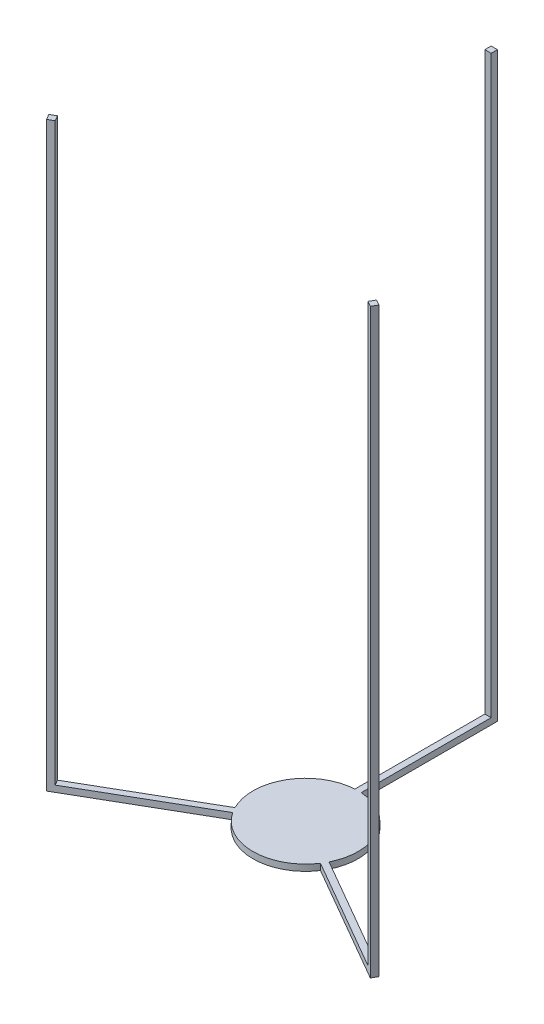
ISO-10303-21;
HEADER;
FILE_DESCRIPTION(('STEP AP214'),'2;1');
FILE_NAME('part.step','',(''),(''),'','','');
FILE_SCHEMA(('AUTOMOTIVE_DESIGN { 1 0 10303 214 1 1 1 1 }'));
ENDSEC;
DATA;
#1=APPLICATION_CONTEXT('core data for automotive mechanical design processes');
#2=APPLICATION_PROTOCOL_DEFINITION('international standard','automotive_design',2000,#1);
#3=PRODUCT_CONTEXT('',#1,'mechanical');
#4=PRODUCT('Part','Part','',(#3));
#5=PRODUCT_RELATED_PRODUCT_CATEGORY('part','',(#4));
#6=PRODUCT_DEFINITION_FORMATION('','',#4);
#7=PRODUCT_DEFINITION_CONTEXT('part definition',#1,'design');
#8=PRODUCT_DEFINITION('design','',#6,#7);
#9=PRODUCT_DEFINITION_SHAPE('','',#8);
#10=(LENGTH_UNIT() NAMED_UNIT(*) SI_UNIT(.MILLI.,.METRE.));
#11=(NAMED_UNIT(*) PLANE_ANGLE_UNIT() SI_UNIT($,.RADIAN.));
#12=(NAMED_UNIT(*) SI_UNIT($,.STERADIAN.) SOLID_ANGLE_UNIT());
#13=UNCERTAINTY_MEASURE_WITH_UNIT(LENGTH_MEASURE(1.E-05),#10,'distance_accuracy_value','');
#14=(GEOMETRIC_REPRESENTATION_CONTEXT(3) GLOBAL_UNCERTAINTY_ASSIGNED_CONTEXT((#13)) GLOBAL_UNIT_ASSIGNED_CONTEXT((#10,
#11,#12)) REPRESENTATION_CONTEXT('',''));
#15=CARTESIAN_POINT('',(0.,0.,0.));
#16=DIRECTION('',(0.,0.,1.));
#17=DIRECTION('',(1.,0.,0.));
#18=AXIS2_PLACEMENT_3D('',#15,#16,#17);
#19=CARTESIAN_POINT('',(0.,3.,0.));
#20=DIRECTION('',(0.,-1.,0.));
#21=DIRECTION('',(0.,0.,-1.));
#22=AXIS2_PLACEMENT_3D('',#19,#20,#21);
#23=CYLINDRICAL_SURFACE('',#22,50.);
#24=CARTESIAN_POINT('',(0.,3.,0.));
#25=DIRECTION('',(0.,1.,0.));
#26=DIRECTION('',(0.,0.,1.));
#27=AXIS2_PLACEMENT_3D('',#24,#25,#26);
#28=CIRCLE('',#27,50.);
#29=CARTESIAN_POINT('',(-41.7232576282726,3.,27.5530356382885));
#30=VERTEX_POINT('',#29);
#31=CARTESIAN_POINT('',(41.7232576282722,3.,27.5530356382891));
#32=VERTEX_POINT('',#31);
#33=EDGE_CURVE('E241',#30,#32,#28,.T.);
#34=ORIENTED_EDGE('',*,*,#33,.F.);
#35=DIRECTION('',(0.,-1.,0.));
#36=VECTOR('',#35,1.);
#37=CARTESIAN_POINT('',(-41.7232576282726,3.,27.5530356382885));
#38=LINE('',#37,#36);
#39=CARTESIAN_POINT('',(-41.7232576282726,-3.,27.5530356382885));
#40=VERTEX_POINT('',#39);
#41=EDGE_CURVE('E12',#30,#40,#38,.T.);
#42=ORIENTED_EDGE('',*,*,#41,.T.);
#43=CARTESIAN_POINT('',(0.,-3.,0.));
#44=DIRECTION('',(0.,1.,0.));
#45=DIRECTION('',(0.,0.,1.));
#46=AXIS2_PLACEMENT_3D('',#43,#44,#45);
#47=CIRCLE('',#46,50.);
#48=CARTESIAN_POINT('',(41.7232576282722,-3.,27.5530356382891));
#49=VERTEX_POINT('',#48);
#50=EDGE_CURVE('E188',#40,#49,#47,.T.);
#51=ORIENTED_EDGE('',*,*,#50,.T.);
#52=DIRECTION('',(0.,-1.,0.));
#53=VECTOR('',#52,1.);
#54=CARTESIAN_POINT('',(41.7232576282722,3.,27.5530356382891));
#55=LINE('',#54,#53);
#56=EDGE_CURVE('E289',#49,#32,#55,.F.);
#57=ORIENTED_EDGE('',*,*,#56,.T.);
#58=EDGE_LOOP('',(#34,#42,#51,#57));
#59=FACE_BOUND('',#58,.T.);
#60=ADVANCED_FACE('F38',(#59),#23,.T.);
#61=CARTESIAN_POINT('',(44.7232576282722,3.,22.3568832155824));
#62=VERTEX_POINT('',#61);
#63=CARTESIAN_POINT('',(3.,3.,-49.9099188538711));
#64=VERTEX_POINT('',#63);
#65=EDGE_CURVE('E242',#62,#64,#28,.T.);
#66=ORIENTED_EDGE('',*,*,#65,.F.);
#67=DIRECTION('',(0.,-1.,0.));
#68=VECTOR('',#67,1.);
#69=CARTESIAN_POINT('',(44.7232576282722,3.,22.3568832155824));
#70=LINE('',#69,#68);
#71=CARTESIAN_POINT('',(44.7232576282722,-3.,22.3568832155824));
#72=VERTEX_POINT('',#71);
#73=EDGE_CURVE('E292',#62,#72,#70,.T.);
#74=ORIENTED_EDGE('',*,*,#73,.T.);
#75=CARTESIAN_POINT('',(3.,-3.,-49.9099188538711));
#76=VERTEX_POINT('',#75);
#77=EDGE_CURVE('E236',#72,#76,#47,.T.);
#78=ORIENTED_EDGE('',*,*,#77,.T.);
#79=DIRECTION('',(0.,-1.,0.));
#80=VECTOR('',#79,1.);
#81=CARTESIAN_POINT('',(3.,3.,-49.9099188538711));
#82=LINE('',#81,#80);
#83=EDGE_CURVE('E240',#64,#76,#82,.T.);
#84=ORIENTED_EDGE('',*,*,#83,.F.);
#85=EDGE_LOOP('',(#66,#74,#78,#84));
#86=FACE_BOUND('',#85,.T.);
#87=ADVANCED_FACE('F329',(#86),#23,.T.);
#88=CARTESIAN_POINT('',(-3.,3.,-184.935281374239));
#89=DIRECTION('',(-1.,0.,0.));
#90=DIRECTION('',(0.,0.,1.));
#91=AXIS2_PLACEMENT_3D('',#88,#89,#90);
#92=PLANE('',#91);
#93=DIRECTION('',(0.,0.,1.));
#94=VECTOR('',#93,1.);
#95=CARTESIAN_POINT('',(-3.,-3.,-184.935281374239));
#96=LINE('',#95,#94);
#97=CARTESIAN_POINT('',(-3.,-3.,-179.45));
#98=VERTEX_POINT('',#97);
#99=CARTESIAN_POINT('',(-3.,-3.,-49.9099188538711));
#100=VERTEX_POINT('',#99);
#101=EDGE_CURVE('E251',#98,#100,#96,.T.);
#102=ORIENTED_EDGE('',*,*,#101,.T.);
#103=DIRECTION('',(0.,-1.,0.));
#104=VECTOR('',#103,1.);
#105=CARTESIAN_POINT('',(-3.,3.,-49.9099188538711));
#106=LINE('',#105,#104);
#107=CARTESIAN_POINT('',(-3.,3.,-49.9099188538711));
#108=VERTEX_POINT('',#107);
#109=EDGE_CURVE('E248',#100,#108,#106,.F.);
#110=ORIENTED_EDGE('',*,*,#109,.T.);
#111=DIRECTION('',(0.,0.,1.));
#112=VECTOR('',#111,1.);
#113=CARTESIAN_POINT('',(-3.,3.,-184.935281374239));
#114=LINE('',#113,#112);
#115=CARTESIAN_POINT('',(-3.,3.,-173.45));
#116=VERTEX_POINT('',#115);
#117=EDGE_CURVE('E264',#116,#108,#114,.T.);
#118=ORIENTED_EDGE('',*,*,#117,.F.);
#119=DIRECTION('',(0.,1.,0.));
#120=VECTOR('',#119,1.);
#121=CARTESIAN_POINT('',(-3.,3.,-173.45));
#122=LINE('',#121,#120);
#123=CARTESIAN_POINT('',(-3.,550.,-173.45));
#124=VERTEX_POINT('',#123);
#125=EDGE_CURVE('E280',#116,#124,#122,.T.);
#126=ORIENTED_EDGE('',*,*,#125,.T.);
#127=DIRECTION('',(0.,0.,1.));
#128=VECTOR('',#127,1.);
#129=CARTESIAN_POINT('',(-3.,550.,-179.192640687119));
#130=LINE('',#129,#128);
#131=CARTESIAN_POINT('',(-3.,550.,-179.45));
#132=VERTEX_POINT('',#131);
#133=EDGE_CURVE('E252',#132,#124,#130,.T.);
#134=ORIENTED_EDGE('',*,*,#133,.F.);
#135=DIRECTION('',(0.,1.,0.));
#136=VECTOR('',#135,1.);
#137=CARTESIAN_POINT('',(-3.,-3.,-179.45));
#138=LINE('',#137,#136);
#139=EDGE_CURVE('E283',#98,#132,#138,.T.);
#140=ORIENTED_EDGE('',*,*,#139,.F.);
#141=EDGE_LOOP('',(#102,#110,#118,#126,#134,#140));
#142=FACE_BOUND('',#141,.T.);
#143=ADVANCED_FACE('F305',(#142),#92,.T.);
#144=CARTESIAN_POINT('',(3.,3.,-184.935281374239));
#145=DIRECTION('',(1.,0.,0.));
#146=DIRECTION('',(0.,0.,-1.));
#147=AXIS2_PLACEMENT_3D('',#144,#145,#146);
#148=PLANE('',#147);
#149=DIRECTION('',(0.,0.,1.));
#150=VECTOR('',#149,1.);
#151=CARTESIAN_POINT('',(3.,3.,-184.935281374239));
#152=LINE('',#151,#150);
#153=CARTESIAN_POINT('',(3.,3.,-173.45));
#154=VERTEX_POINT('',#153);
#155=EDGE_CURVE('E270',#154,#64,#152,.T.);
#156=ORIENTED_EDGE('',*,*,#155,.T.);
#157=ORIENTED_EDGE('',*,*,#83,.T.);
#158=DIRECTION('',(0.,0.,1.));
#159=VECTOR('',#158,1.);
#160=CARTESIAN_POINT('',(3.,-3.,-184.935281374239));
#161=LINE('',#160,#159);
#162=CARTESIAN_POINT('',(3.,-3.,-179.45));
#163=VERTEX_POINT('',#162);
#164=EDGE_CURVE('E273',#163,#76,#161,.T.);
#165=ORIENTED_EDGE('',*,*,#164,.F.);
#166=DIRECTION('',(0.,1.,0.));
#167=VECTOR('',#166,1.);
#168=CARTESIAN_POINT('',(3.,-3.,-179.45));
#169=LINE('',#168,#167);
#170=CARTESIAN_POINT('',(3.,550.,-179.45));
#171=VERTEX_POINT('',#170);
#172=EDGE_CURVE('E255',#163,#171,#169,.T.);
#173=ORIENTED_EDGE('',*,*,#172,.T.);
#174=DIRECTION('',(0.,0.,-1.));
#175=VECTOR('',#174,1.);
#176=CARTESIAN_POINT('',(3.,550.,-179.192640687119));
#177=LINE('',#176,#175);
#178=CARTESIAN_POINT('',(3.,550.,-173.45));
#179=VERTEX_POINT('',#178);
#180=EDGE_CURVE('E257',#179,#171,#177,.T.);
#181=ORIENTED_EDGE('',*,*,#180,.F.);
#182=DIRECTION('',(0.,1.,0.));
#183=VECTOR('',#182,1.);
#184=CARTESIAN_POINT('',(3.,3.,-173.45));
#185=LINE('',#184,#183);
#186=EDGE_CURVE('E267',#154,#179,#185,.T.);
#187=ORIENTED_EDGE('',*,*,#186,.F.);
#188=EDGE_LOOP('',(#156,#157,#165,#173,#181,#187));
#189=FACE_BOUND('',#188,.T.);
#190=ADVANCED_FACE('F333',(#189),#148,.T.);
#191=CARTESIAN_POINT('',(-3.,3.,-173.45));
#192=DIRECTION('',(0.,0.,-1.));
#193=DIRECTION('',(-1.,0.,0.));
#194=AXIS2_PLACEMENT_3D('',#191,#192,#193);
#195=PLANE('',#194);
#196=DIRECTION('',(1.,0.,0.));
#197=VECTOR('',#196,1.);
#198=CARTESIAN_POINT('',(-3.,550.,-173.45));
#199=LINE('',#198,#197);
#200=EDGE_CURVE('E254',#124,#179,#199,.T.);
#201=ORIENTED_EDGE('',*,*,#200,.F.);
#202=ORIENTED_EDGE('',*,*,#125,.F.);
#203=DIRECTION('',(-1.,0.,0.));
#204=VECTOR('',#203,1.);
#205=CARTESIAN_POINT('',(-3.,3.,-173.45));
#206=LINE('',#205,#204);
#207=EDGE_CURVE('E263',#154,#116,#206,.T.);
#208=ORIENTED_EDGE('',*,*,#207,.F.);
#209=ORIENTED_EDGE('',*,*,#186,.T.);
#210=EDGE_LOOP('',(#201,#202,#208,#209));
#211=FACE_BOUND('',#210,.T.);
#212=ADVANCED_FACE('F337',(#211),#195,.F.);
#213=CARTESIAN_POINT('',(-3.,-3.,-179.45));
#214=DIRECTION('',(0.,0.,1.));
#215=DIRECTION('',(1.,0.,0.));
#216=AXIS2_PLACEMENT_3D('',#213,#214,#215);
#217=PLANE('',#216);
#218=DIRECTION('',(-1.,0.,0.));
#219=VECTOR('',#218,1.);
#220=CARTESIAN_POINT('',(-3.,550.,-179.45));
#221=LINE('',#220,#219);
#222=EDGE_CURVE('E259',#171,#132,#221,.T.);
#223=ORIENTED_EDGE('',*,*,#222,.F.);
#224=ORIENTED_EDGE('',*,*,#172,.F.);
#225=DIRECTION('',(1.,0.,0.));
#226=VECTOR('',#225,1.);
#227=CARTESIAN_POINT('',(-3.,-3.,-179.45));
#228=LINE('',#227,#226);
#229=EDGE_CURVE('E260',#98,#163,#228,.T.);
#230=ORIENTED_EDGE('',*,*,#229,.F.);
#231=ORIENTED_EDGE('',*,*,#139,.T.);
#232=EDGE_LOOP('',(#223,#224,#230,#231));
#233=FACE_BOUND('',#232,.T.);
#234=ADVANCED_FACE('F40',(#233),#217,.F.);
#235=CARTESIAN_POINT('',(-3.,-3.,-184.935281374239));
#236=DIRECTION('',(0.,-1.,0.));
#237=DIRECTION('',(0.,0.,-1.));
#238=AXIS2_PLACEMENT_3D('',#235,#236,#237);
#239=PLANE('',#238);
#240=ORIENTED_EDGE('',*,*,#50,.F.);
#241=DIRECTION('',(0.866025403784443,0.,-0.499999999999992));
#242=VECTOR('',#241,1.);
#243=CARTESIAN_POINT('',(-158.658651726115,-3.,95.0657168984711));
#244=LINE('',#243,#242);
#245=CARTESIAN_POINT('',(-153.908258709118,-3.,92.3230762113519));
#246=VERTEX_POINT('',#245);
#247=EDGE_CURVE('E168',#246,#40,#244,.T.);
#248=ORIENTED_EDGE('',*,*,#247,.F.);
#249=DIRECTION('',(-0.499999999999992,0.,-0.866025403784443));
#250=VECTOR('',#249,1.);
#251=CARTESIAN_POINT('',(-153.908258709118,-3.,92.3230762113519));
#252=LINE('',#251,#250);
#253=CARTESIAN_POINT('',(-156.908258709118,-3.,87.1269237886452));
#254=VERTEX_POINT('',#253);
#255=EDGE_CURVE('E177',#246,#254,#252,.T.);
#256=ORIENTED_EDGE('',*,*,#255,.T.);
#257=DIRECTION('',(0.866025403784443,0.,-0.499999999999992));
#258=VECTOR('',#257,1.);
#259=CARTESIAN_POINT('',(-161.658651726115,-3.,89.8695644757645));
#260=LINE('',#259,#258);
#261=CARTESIAN_POINT('',(-44.7232576282725,-3.,22.3568832155818));
#262=VERTEX_POINT('',#261);
#263=EDGE_CURVE('E189',#254,#262,#260,.T.);
#264=ORIENTED_EDGE('',*,*,#263,.T.);
#265=EDGE_CURVE('E243',#100,#262,#47,.T.);
#266=ORIENTED_EDGE('',*,*,#265,.F.);
#267=ORIENTED_EDGE('',*,*,#101,.F.);
#268=ORIENTED_EDGE('',*,*,#229,.T.);
#269=ORIENTED_EDGE('',*,*,#164,.T.);
#270=ORIENTED_EDGE('',*,*,#77,.F.);
#271=DIRECTION('',(-0.866025403784436,0.,-0.500000000000004));
#272=VECTOR('',#271,1.);
#273=CARTESIAN_POINT('',(161.658651726113,-3.,89.8695644757667));
#274=LINE('',#273,#272);
#275=CARTESIAN_POINT('',(156.908258709117,-3.,87.1269237886474));
#276=VERTEX_POINT('',#275);
#277=EDGE_CURVE('E202',#276,#72,#274,.T.);
#278=ORIENTED_EDGE('',*,*,#277,.F.);
#279=DIRECTION('',(-0.500000000000004,0.,0.866025403784436));
#280=VECTOR('',#279,1.);
#281=CARTESIAN_POINT('',(156.908258709117,-3.,87.1269237886474));
#282=LINE('',#281,#280);
#283=CARTESIAN_POINT('',(153.908258709117,-3.,92.323076211354));
#284=VERTEX_POINT('',#283);
#285=EDGE_CURVE('E212',#276,#284,#282,.T.);
#286=ORIENTED_EDGE('',*,*,#285,.T.);
#287=DIRECTION('',(-0.866025403784436,0.,-0.500000000000004));
#288=VECTOR('',#287,1.);
#289=CARTESIAN_POINT('',(158.658651726113,-3.,95.0657168984733));
#290=LINE('',#289,#288);
#291=EDGE_CURVE('E222',#284,#49,#290,.T.);
#292=ORIENTED_EDGE('',*,*,#291,.T.);
#293=EDGE_LOOP('',(#240,#248,#256,#264,#266,#267,#268,#269,#270,#278,#286,#292));
#294=FACE_BOUND('',#293,.T.);
#295=ADVANCED_FACE('F186',(#294),#239,.T.);
#296=CARTESIAN_POINT('',(-3.,3.,-184.935281374239));
#297=DIRECTION('',(0.,1.,0.));
#298=DIRECTION('',(0.,0.,1.));
#299=AXIS2_PLACEMENT_3D('',#296,#297,#298);
#300=PLANE('',#299);
#301=DIRECTION('',(0.866025403784443,0.,-0.499999999999992));
#302=VECTOR('',#301,1.);
#303=CARTESIAN_POINT('',(-158.658651726115,3.,95.0657168984711));
#304=LINE('',#303,#302);
#305=CARTESIAN_POINT('',(-148.712106286412,3.,89.3230762113519));
#306=VERTEX_POINT('',#305);
#307=EDGE_CURVE('E53',#306,#30,#304,.T.);
#308=ORIENTED_EDGE('',*,*,#307,.T.);
#309=ORIENTED_EDGE('',*,*,#33,.T.);
#310=DIRECTION('',(-0.866025403784436,0.,-0.500000000000004));
#311=VECTOR('',#310,1.);
#312=CARTESIAN_POINT('',(158.658651726113,3.,95.0657168984733));
#313=LINE('',#312,#311);
#314=CARTESIAN_POINT('',(148.712106286411,3.,89.323076211354));
#315=VERTEX_POINT('',#314);
#316=EDGE_CURVE('E219',#315,#32,#313,.T.);
#317=ORIENTED_EDGE('',*,*,#316,.F.);
#318=DIRECTION('',(0.500000000000004,0.,-0.866025403784436));
#319=VECTOR('',#318,1.);
#320=CARTESIAN_POINT('',(151.712106286411,3.,84.1269237886474));
#321=LINE('',#320,#319);
#322=CARTESIAN_POINT('',(151.712106286411,3.,84.1269237886474));
#323=VERTEX_POINT('',#322);
#324=EDGE_CURVE('E215',#315,#323,#321,.T.);
#325=ORIENTED_EDGE('',*,*,#324,.T.);
#326=DIRECTION('',(-0.866025403784436,0.,-0.500000000000004));
#327=VECTOR('',#326,1.);
#328=CARTESIAN_POINT('',(161.658651726113,3.,89.8695644757667));
#329=LINE('',#328,#327);
#330=EDGE_CURVE('E60',#323,#62,#329,.T.);
#331=ORIENTED_EDGE('',*,*,#330,.T.);
#332=ORIENTED_EDGE('',*,*,#65,.T.);
#333=ORIENTED_EDGE('',*,*,#155,.F.);
#334=ORIENTED_EDGE('',*,*,#207,.T.);
#335=ORIENTED_EDGE('',*,*,#117,.T.);
#336=CARTESIAN_POINT('',(-44.7232576282725,3.,22.3568832155818));
#337=VERTEX_POINT('',#336);
#338=EDGE_CURVE('E237',#108,#337,#28,.T.);
#339=ORIENTED_EDGE('',*,*,#338,.T.);
#340=DIRECTION('',(0.866025403784443,0.,-0.499999999999992));
#341=VECTOR('',#340,1.);
#342=CARTESIAN_POINT('',(-161.658651726115,3.,89.8695644757645));
#343=LINE('',#342,#341);
#344=CARTESIAN_POINT('',(-151.712106286412,3.,84.1269237886453));
#345=VERTEX_POINT('',#344);
#346=EDGE_CURVE('E191',#345,#337,#343,.T.);
#347=ORIENTED_EDGE('',*,*,#346,.F.);
#348=DIRECTION('',(0.499999999999992,0.,0.866025403784443));
#349=VECTOR('',#348,1.);
#350=CARTESIAN_POINT('',(-148.712106286412,3.,89.3230762113519));
#351=LINE('',#350,#349);
#352=EDGE_CURVE('E183',#345,#306,#351,.T.);
#353=ORIENTED_EDGE('',*,*,#352,.T.);
#354=EDGE_LOOP('',(#308,#309,#317,#325,#331,#332,#333,#334,#335,#339,#347,#353));
#355=FACE_BOUND('',#354,.T.);
#356=ADVANCED_FACE('F300',(#355),#300,.T.);
#357=CARTESIAN_POINT('',(0.,550.,-176.45));
#358=DIRECTION('',(0.,1.,0.));
#359=DIRECTION('',(0.,0.,1.));
#360=AXIS2_PLACEMENT_3D('',#357,#358,#359);
#361=PLANE('',#360);
#362=ORIENTED_EDGE('',*,*,#180,.T.);
#363=ORIENTED_EDGE('',*,*,#222,.T.);
#364=ORIENTED_EDGE('',*,*,#133,.T.);
#365=ORIENTED_EDGE('',*,*,#200,.T.);
#366=EDGE_LOOP('',(#362,#363,#364,#365));
#367=FACE_BOUND('',#366,.T.);
#368=ADVANCED_FACE('F339',(#367),#361,.T.);
#369=ORIENTED_EDGE('',*,*,#265,.T.);
#370=DIRECTION('',(0.,-1.,0.));
#371=VECTOR('',#370,1.);
#372=CARTESIAN_POINT('',(-44.7232576282725,3.,22.3568832155818));
#373=LINE('',#372,#371);
#374=EDGE_CURVE('E46',#262,#337,#373,.F.);
#375=ORIENTED_EDGE('',*,*,#374,.T.);
#376=ORIENTED_EDGE('',*,*,#338,.F.);
#377=ORIENTED_EDGE('',*,*,#109,.F.);
#378=EDGE_LOOP('',(#369,#375,#376,#377));
#379=FACE_BOUND('',#378,.T.);
#380=ADVANCED_FACE('F296',(#379),#23,.T.);
#381=CARTESIAN_POINT('',(161.658651726113,3.,89.8695644757667));
#382=DIRECTION('',(0.500000000000004,0.,-0.866025403784436));
#383=DIRECTION('',(-0.866025403784436,0.,-0.500000000000004));
#384=AXIS2_PLACEMENT_3D('',#381,#382,#383);
#385=PLANE('',#384);
#386=ORIENTED_EDGE('',*,*,#73,.F.);
#387=ORIENTED_EDGE('',*,*,#330,.F.);
#388=DIRECTION('',(0.,1.,0.));
#389=VECTOR('',#388,1.);
#390=CARTESIAN_POINT('',(151.712106286411,3.,84.1269237886474));
#391=LINE('',#390,#389);
#392=CARTESIAN_POINT('',(151.712106286411,550.,84.1269237886474));
#393=VERTEX_POINT('',#392);
#394=EDGE_CURVE('E227',#323,#393,#391,.T.);
#395=ORIENTED_EDGE('',*,*,#394,.T.);
#396=DIRECTION('',(-0.866025403784436,0.,-0.500000000000004));
#397=VECTOR('',#396,1.);
#398=CARTESIAN_POINT('',(156.685379006262,550.,86.998244132207));
#399=LINE('',#398,#397);
#400=CARTESIAN_POINT('',(156.908258709117,550.,87.1269237886474));
#401=VERTEX_POINT('',#400);
#402=EDGE_CURVE('E204',#401,#393,#399,.T.);
#403=ORIENTED_EDGE('',*,*,#402,.F.);
#404=DIRECTION('',(0.,1.,0.));
#405=VECTOR('',#404,1.);
#406=CARTESIAN_POINT('',(156.908258709117,-3.,87.1269237886474));
#407=LINE('',#406,#405);
#408=EDGE_CURVE('E230',#276,#401,#407,.T.);
#409=ORIENTED_EDGE('',*,*,#408,.F.);
#410=ORIENTED_EDGE('',*,*,#277,.T.);
#411=EDGE_LOOP('',(#386,#387,#395,#403,#409,#410));
#412=FACE_BOUND('',#411,.T.);
#413=ADVANCED_FACE('F358',(#412),#385,.T.);
#414=CARTESIAN_POINT('',(158.658651726113,3.,95.0657168984733));
#415=DIRECTION('',(-0.500000000000004,0.,0.866025403784436));
#416=DIRECTION('',(0.866025403784436,0.,0.500000000000004));
#417=AXIS2_PLACEMENT_3D('',#414,#415,#416);
#418=PLANE('',#417);
#419=ORIENTED_EDGE('',*,*,#56,.F.);
#420=ORIENTED_EDGE('',*,*,#291,.F.);
#421=DIRECTION('',(0.,1.,0.));
#422=VECTOR('',#421,1.);
#423=CARTESIAN_POINT('',(153.908258709117,-3.,92.323076211354));
#424=LINE('',#423,#422);
#425=CARTESIAN_POINT('',(153.908258709117,550.,92.323076211354));
#426=VERTEX_POINT('',#425);
#427=EDGE_CURVE('E207',#284,#426,#424,.T.);
#428=ORIENTED_EDGE('',*,*,#427,.T.);
#429=DIRECTION('',(0.866025403784436,0.,0.500000000000004));
#430=VECTOR('',#429,1.);
#431=CARTESIAN_POINT('',(153.685379006262,550.,92.1943965549137));
#432=LINE('',#431,#430);
#433=CARTESIAN_POINT('',(148.71210628641,550.,89.323076211354));
#434=VERTEX_POINT('',#433);
#435=EDGE_CURVE('E209',#434,#426,#432,.T.);
#436=ORIENTED_EDGE('',*,*,#435,.F.);
#437=DIRECTION('',(0.,1.,0.));
#438=VECTOR('',#437,1.);
#439=CARTESIAN_POINT('',(148.712106286411,3.,89.323076211354));
#440=LINE('',#439,#438);
#441=EDGE_CURVE('E217',#315,#434,#440,.T.);
#442=ORIENTED_EDGE('',*,*,#441,.F.);
#443=ORIENTED_EDGE('',*,*,#316,.T.);
#444=EDGE_LOOP('',(#419,#420,#428,#436,#442,#443));
#445=FACE_BOUND('',#444,.T.);
#446=ADVANCED_FACE('F346',(#445),#418,.T.);
#447=CARTESIAN_POINT('',(151.712106286411,3.,84.1269237886474));
#448=DIRECTION('',(0.866025403784436,0.,0.500000000000004));
#449=DIRECTION('',(0.500000000000004,0.,-0.866025403784436));
#450=AXIS2_PLACEMENT_3D('',#447,#448,#449);
#451=PLANE('',#450);
#452=DIRECTION('',(-0.500000000000004,0.,0.866025403784436));
#453=VECTOR('',#452,1.);
#454=CARTESIAN_POINT('',(151.712106286411,550.,84.1269237886474));
#455=LINE('',#454,#453);
#456=EDGE_CURVE('E206',#393,#434,#455,.T.);
#457=ORIENTED_EDGE('',*,*,#456,.F.);
#458=ORIENTED_EDGE('',*,*,#394,.F.);
#459=ORIENTED_EDGE('',*,*,#324,.F.);
#460=ORIENTED_EDGE('',*,*,#441,.T.);
#461=EDGE_LOOP('',(#457,#458,#459,#460));
#462=FACE_BOUND('',#461,.T.);
#463=ADVANCED_FACE('F356',(#462),#451,.F.);
#464=CARTESIAN_POINT('',(156.908258709117,-3.,87.1269237886474));
#465=DIRECTION('',(-0.866025403784436,0.,-0.500000000000004));
#466=DIRECTION('',(-0.500000000000004,0.,0.866025403784436));
#467=AXIS2_PLACEMENT_3D('',#464,#465,#466);
#468=PLANE('',#467);
#469=DIRECTION('',(0.500000000000004,0.,-0.866025403784436));
#470=VECTOR('',#469,1.);
#471=CARTESIAN_POINT('',(156.908258709117,550.,87.1269237886474));
#472=LINE('',#471,#470);
#473=EDGE_CURVE('E211',#426,#401,#472,.T.);
#474=ORIENTED_EDGE('',*,*,#473,.F.);
#475=ORIENTED_EDGE('',*,*,#427,.F.);
#476=ORIENTED_EDGE('',*,*,#285,.F.);
#477=ORIENTED_EDGE('',*,*,#408,.T.);
#478=EDGE_LOOP('',(#474,#475,#476,#477));
#479=FACE_BOUND('',#478,.T.);
#480=ADVANCED_FACE('F350',(#479),#468,.F.);
#481=CARTESIAN_POINT('',(152.810182497764,550.,88.2250000000007));
#482=DIRECTION('',(0.,1.,0.));
#483=DIRECTION('',(0.,0.,1.));
#484=AXIS2_PLACEMENT_3D('',#481,#482,#483);
#485=PLANE('',#484);
#486=ORIENTED_EDGE('',*,*,#435,.T.);
#487=ORIENTED_EDGE('',*,*,#473,.T.);
#488=ORIENTED_EDGE('',*,*,#402,.T.);
#489=ORIENTED_EDGE('',*,*,#456,.T.);
#490=EDGE_LOOP('',(#486,#487,#488,#489));
#491=FACE_BOUND('',#490,.T.);
#492=ADVANCED_FACE('F360',(#491),#485,.T.);
#493=CARTESIAN_POINT('',(-158.658651726115,3.,95.0657168984711));
#494=DIRECTION('',(0.499999999999992,0.,0.866025403784443));
#495=DIRECTION('',(0.866025403784443,0.,-0.499999999999992));
#496=AXIS2_PLACEMENT_3D('',#493,#494,#495);
#497=PLANE('',#496);
#498=ORIENTED_EDGE('',*,*,#41,.F.);
#499=ORIENTED_EDGE('',*,*,#307,.F.);
#500=DIRECTION('',(0.,1.,0.));
#501=VECTOR('',#500,1.);
#502=CARTESIAN_POINT('',(-148.712106286412,3.,89.3230762113519));
#503=LINE('',#502,#501);
#504=CARTESIAN_POINT('',(-148.712106286412,550.,89.3230762113519));
#505=VERTEX_POINT('',#504);
#506=EDGE_CURVE('E174',#306,#505,#503,.T.);
#507=ORIENTED_EDGE('',*,*,#506,.T.);
#508=DIRECTION('',(0.866025403784443,0.,-0.499999999999992));
#509=VECTOR('',#508,1.);
#510=CARTESIAN_POINT('',(-153.685379006263,550.,92.1943965549115));
#511=LINE('',#510,#509);
#512=CARTESIAN_POINT('',(-153.908258709118,550.,92.3230762113519));
#513=VERTEX_POINT('',#512);
#514=EDGE_CURVE('E170',#513,#505,#511,.T.);
#515=ORIENTED_EDGE('',*,*,#514,.F.);
#516=DIRECTION('',(0.,1.,0.));
#517=VECTOR('',#516,1.);
#518=CARTESIAN_POINT('',(-153.908258709118,-3.,92.3230762113519));
#519=LINE('',#518,#517);
#520=EDGE_CURVE('E164',#246,#513,#519,.T.);
#521=ORIENTED_EDGE('',*,*,#520,.F.);
#522=ORIENTED_EDGE('',*,*,#247,.T.);
#523=EDGE_LOOP('',(#498,#499,#507,#515,#521,#522));
#524=FACE_BOUND('',#523,.T.);
#525=ADVANCED_FACE('F166',(#524),#497,.T.);
#526=CARTESIAN_POINT('',(-161.658651726115,3.,89.8695644757645));
#527=DIRECTION('',(-0.499999999999992,0.,-0.866025403784443));
#528=DIRECTION('',(-0.866025403784443,0.,0.499999999999992));
#529=AXIS2_PLACEMENT_3D('',#526,#527,#528);
#530=PLANE('',#529);
#531=ORIENTED_EDGE('',*,*,#374,.F.);
#532=ORIENTED_EDGE('',*,*,#263,.F.);
#533=DIRECTION('',(0.,1.,0.));
#534=VECTOR('',#533,1.);
#535=CARTESIAN_POINT('',(-156.908258709118,-3.,87.1269237886452));
#536=LINE('',#535,#534);
#537=CARTESIAN_POINT('',(-156.908258709118,550.,87.1269237886452));
#538=VERTEX_POINT('',#537);
#539=EDGE_CURVE('E173',#254,#538,#536,.T.);
#540=ORIENTED_EDGE('',*,*,#539,.T.);
#541=DIRECTION('',(-0.866025403784443,0.,0.499999999999992));
#542=VECTOR('',#541,1.);
#543=CARTESIAN_POINT('',(-156.685379006263,550.,86.9982441322049));
#544=LINE('',#543,#542);
#545=CARTESIAN_POINT('',(-151.712106286412,550.,84.1269237886453));
#546=VERTEX_POINT('',#545);
#547=EDGE_CURVE('E203',#546,#538,#544,.T.);
#548=ORIENTED_EDGE('',*,*,#547,.F.);
#549=DIRECTION('',(0.,1.,0.));
#550=VECTOR('',#549,1.);
#551=CARTESIAN_POINT('',(-151.712106286412,3.,84.1269237886453));
#552=LINE('',#551,#550);
#553=EDGE_CURVE('E195',#345,#546,#552,.T.);
#554=ORIENTED_EDGE('',*,*,#553,.F.);
#555=ORIENTED_EDGE('',*,*,#346,.T.);
#556=EDGE_LOOP('',(#531,#532,#540,#548,#554,#555));
#557=FACE_BOUND('',#556,.T.);
#558=ADVANCED_FACE('F308',(#557),#530,.T.);
#559=CARTESIAN_POINT('',(-148.712106286412,3.,89.3230762113519));
#560=DIRECTION('',(-0.866025403784443,0.,0.499999999999992));
#561=DIRECTION('',(0.499999999999992,0.,0.866025403784443));
#562=AXIS2_PLACEMENT_3D('',#559,#560,#561);
#563=PLANE('',#562);
#564=DIRECTION('',(-0.499999999999992,0.,-0.866025403784443));
#565=VECTOR('',#564,1.);
#566=CARTESIAN_POINT('',(-148.712106286412,550.,89.3230762113519));
#567=LINE('',#566,#565);
#568=EDGE_CURVE('E313',#505,#546,#567,.T.);
#569=ORIENTED_EDGE('',*,*,#568,.F.);
#570=ORIENTED_EDGE('',*,*,#506,.F.);
#571=ORIENTED_EDGE('',*,*,#352,.F.);
#572=ORIENTED_EDGE('',*,*,#553,.T.);
#573=EDGE_LOOP('',(#569,#570,#571,#572));
#574=FACE_BOUND('',#573,.T.);
#575=ADVANCED_FACE('F321',(#574),#563,.F.);
#576=CARTESIAN_POINT('',(-153.908258709118,-3.,92.3230762113519));
#577=DIRECTION('',(0.866025403784443,0.,-0.499999999999992));
#578=DIRECTION('',(-0.499999999999992,0.,-0.866025403784443));
#579=AXIS2_PLACEMENT_3D('',#576,#577,#578);
#580=PLANE('',#579);
#581=DIRECTION('',(0.499999999999992,0.,0.866025403784443));
#582=VECTOR('',#581,1.);
#583=CARTESIAN_POINT('',(-153.908258709118,550.,92.3230762113519));
#584=LINE('',#583,#582);
#585=EDGE_CURVE('E200',#538,#513,#584,.T.);
#586=ORIENTED_EDGE('',*,*,#585,.F.);
#587=ORIENTED_EDGE('',*,*,#539,.F.);
#588=ORIENTED_EDGE('',*,*,#255,.F.);
#589=ORIENTED_EDGE('',*,*,#520,.T.);
#590=EDGE_LOOP('',(#586,#587,#588,#589));
#591=FACE_BOUND('',#590,.T.);
#592=ADVANCED_FACE('F178',(#591),#580,.F.);
#593=CARTESIAN_POINT('',(-152.810182497765,550.,88.2249999999986));
#594=DIRECTION('',(0.,1.,0.));
#595=DIRECTION('',(0.,0.,1.));
#596=AXIS2_PLACEMENT_3D('',#593,#594,#595);
#597=PLANE('',#596);
#598=ORIENTED_EDGE('',*,*,#547,.T.);
#599=ORIENTED_EDGE('',*,*,#585,.T.);
#600=ORIENTED_EDGE('',*,*,#514,.T.);
#601=ORIENTED_EDGE('',*,*,#568,.T.);
#602=EDGE_LOOP('',(#598,#599,#600,#601));
#603=FACE_BOUND('',#602,.T.);
#604=ADVANCED_FACE('F311',(#603),#597,.T.);
#605=CLOSED_SHELL('',(#60,#87,#143,#190,#212,#234,#295,#356,#368,#380,#413,#446,#463,#480,#492,
#525,#558,#575,#592,#604));
#606=MANIFOLD_SOLID_BREP('B2',#605);
#607=ADVANCED_BREP_SHAPE_REPRESENTATION('',(#18,#606),#14);
#608=SHAPE_DEFINITION_REPRESENTATION(#9,#607);
ENDSEC;
END-ISO-10303-21;
